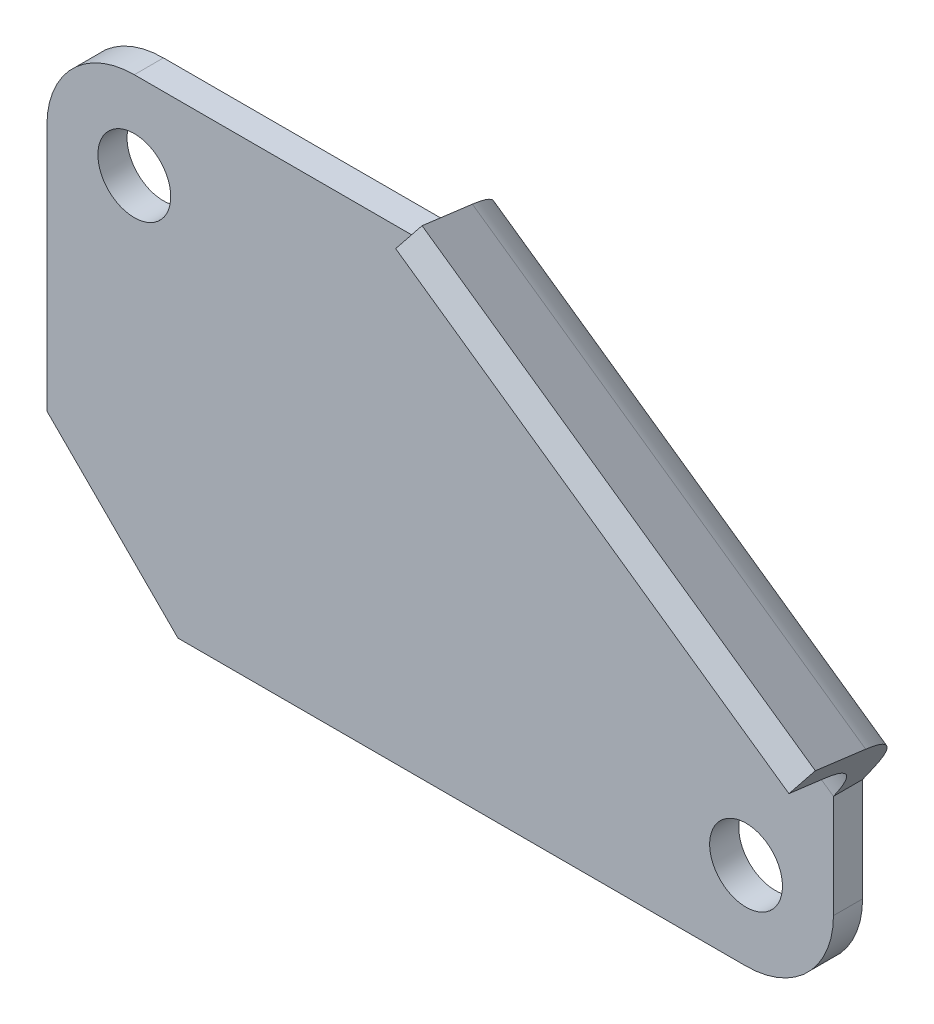
ISO-10303-21;
HEADER;
FILE_DESCRIPTION(('STEP AP214'),'2;1');
FILE_NAME('part.step','',(''),(''),'','','');
FILE_SCHEMA(('AUTOMOTIVE_DESIGN { 1 0 10303 214 1 1 1 1 }'));
ENDSEC;
DATA;
#1=APPLICATION_CONTEXT('core data for automotive mechanical design processes');
#2=APPLICATION_PROTOCOL_DEFINITION('international standard','automotive_design',2000,#1);
#3=PRODUCT_CONTEXT('',#1,'mechanical');
#4=PRODUCT('Part','Part','',(#3));
#5=PRODUCT_RELATED_PRODUCT_CATEGORY('part','',(#4));
#6=PRODUCT_DEFINITION_FORMATION('','',#4);
#7=PRODUCT_DEFINITION_CONTEXT('part definition',#1,'design');
#8=PRODUCT_DEFINITION('design','',#6,#7);
#9=PRODUCT_DEFINITION_SHAPE('','',#8);
#10=(LENGTH_UNIT() NAMED_UNIT(*) SI_UNIT(.MILLI.,.METRE.));
#11=(NAMED_UNIT(*) PLANE_ANGLE_UNIT() SI_UNIT($,.RADIAN.));
#12=(NAMED_UNIT(*) SI_UNIT($,.STERADIAN.) SOLID_ANGLE_UNIT());
#13=UNCERTAINTY_MEASURE_WITH_UNIT(LENGTH_MEASURE(1.E-05),#10,'distance_accuracy_value','');
#14=(GEOMETRIC_REPRESENTATION_CONTEXT(3) GLOBAL_UNCERTAINTY_ASSIGNED_CONTEXT((#13)) GLOBAL_UNIT_ASSIGNED_CONTEXT((#10,
#11,#12)) REPRESENTATION_CONTEXT('',''));
#15=CARTESIAN_POINT('',(0.,0.,0.));
#16=DIRECTION('',(0.,0.,1.));
#17=DIRECTION('',(1.,0.,0.));
#18=AXIS2_PLACEMENT_3D('',#15,#16,#17);
#19=CARTESIAN_POINT('',(12.,34.,4.));
#20=DIRECTION('',(0.,0.,-1.));
#21=DIRECTION('',(-1.,0.,0.));
#22=AXIS2_PLACEMENT_3D('',#19,#20,#21);
#23=PLANE('',#22);
#24=DIRECTION('',(0.707106781186547,-0.707106781186548,0.));
#25=VECTOR('',#24,1.);
#26=CARTESIAN_POINT('',(18.,-18.,4.));
#27=LINE('',#26,#25);
#28=CARTESIAN_POINT('',(0.,0.,4.));
#29=VERTEX_POINT('',#28);
#30=CARTESIAN_POINT('',(18.,-18.,4.));
#31=VERTEX_POINT('',#30);
#32=EDGE_CURVE('E213',#29,#31,#27,.T.);
#33=ORIENTED_EDGE('',*,*,#32,.T.);
#34=DIRECTION('',(1.,0.,0.));
#35=VECTOR('',#34,1.);
#36=CARTESIAN_POINT('',(95.9999999999999,-18.,4.));
#37=LINE('',#36,#35);
#38=CARTESIAN_POINT('',(95.9999999999999,-18.,4.));
#39=VERTEX_POINT('',#38);
#40=EDGE_CURVE('E297',#31,#39,#37,.T.);
#41=ORIENTED_EDGE('',*,*,#40,.T.);
#42=CARTESIAN_POINT('',(96.,-6.,4.));
#43=DIRECTION('',(0.,0.,1.));
#44=DIRECTION('',(-1.,0.,0.));
#45=AXIS2_PLACEMENT_3D('',#42,#43,#44);
#46=CIRCLE('',#45,12.);
#47=CARTESIAN_POINT('',(108.,-5.9999999999999,4.));
#48=VERTEX_POINT('',#47);
#49=EDGE_CURVE('E300',#39,#48,#46,.T.);
#50=ORIENTED_EDGE('',*,*,#49,.T.);
#51=DIRECTION('',(0.,1.,0.));
#52=VECTOR('',#51,1.);
#53=CARTESIAN_POINT('',(108.,8.18879293667554,4.));
#54=LINE('',#53,#52);
#55=CARTESIAN_POINT('',(108.,8.18879293667555,4.));
#56=VERTEX_POINT('',#55);
#57=EDGE_CURVE('E171',#48,#56,#54,.T.);
#58=ORIENTED_EDGE('',*,*,#57,.T.);
#59=DIRECTION('',(-0.819152044288991,0.573576436351047,0.));
#60=VECTOR('',#59,1.);
#61=CARTESIAN_POINT('',(54.,46.,4.));
#62=LINE('',#61,#60);
#63=CARTESIAN_POINT('',(53.9999999999996,45.9999999999994,4.));
#64=VERTEX_POINT('',#63);
#65=EDGE_CURVE('E158',#56,#64,#62,.T.);
#66=ORIENTED_EDGE('',*,*,#65,.T.);
#67=DIRECTION('',(-1.,0.,0.));
#68=VECTOR('',#67,1.);
#69=CARTESIAN_POINT('',(12.0000000000001,46.,4.));
#70=LINE('',#69,#68);
#71=CARTESIAN_POINT('',(12.0000000000001,46.,4.));
#72=VERTEX_POINT('',#71);
#73=EDGE_CURVE('E168',#64,#72,#70,.T.);
#74=ORIENTED_EDGE('',*,*,#73,.T.);
#75=CARTESIAN_POINT('',(12.,34.,4.));
#76=DIRECTION('',(0.,0.,1.));
#77=DIRECTION('',(-1.,0.,0.));
#78=AXIS2_PLACEMENT_3D('',#75,#76,#77);
#79=CIRCLE('',#78,12.);
#80=CARTESIAN_POINT('',(0.,33.9999999999999,4.));
#81=VERTEX_POINT('',#80);
#82=EDGE_CURVE('E179',#72,#81,#79,.T.);
#83=ORIENTED_EDGE('',*,*,#82,.T.);
#84=DIRECTION('',(0.,-1.,0.));
#85=VECTOR('',#84,1.);
#86=CARTESIAN_POINT('',(0.,0.,4.));
#87=LINE('',#86,#85);
#88=EDGE_CURVE('E182',#81,#29,#87,.T.);
#89=ORIENTED_EDGE('',*,*,#88,.T.);
#90=EDGE_LOOP('',(#33,#41,#50,#58,#66,#74,#83,#89));
#91=FACE_BOUND('',#90,.T.);
#92=CARTESIAN_POINT('',(12.,34.,4.));
#93=DIRECTION('',(0.,0.,1.));
#94=DIRECTION('',(1.,0.,0.));
#95=AXIS2_PLACEMENT_3D('',#92,#93,#94);
#96=CIRCLE('',#95,5.);
#97=CARTESIAN_POINT('',(17.,34.,4.));
#98=VERTEX_POINT('',#97);
#99=EDGE_CURVE('E194',#98,#98,#96,.T.);
#100=ORIENTED_EDGE('',*,*,#99,.F.);
#101=EDGE_LOOP('',(#100));
#102=FACE_BOUND('',#101,.T.);
#103=CARTESIAN_POINT('',(96.,-6.,4.));
#104=DIRECTION('',(0.,0.,1.));
#105=DIRECTION('',(1.,0.,0.));
#106=AXIS2_PLACEMENT_3D('',#103,#104,#105);
#107=CIRCLE('',#106,5.);
#108=CARTESIAN_POINT('',(101.,-6.,4.));
#109=VERTEX_POINT('',#108);
#110=EDGE_CURVE('E281',#109,#109,#107,.T.);
#111=ORIENTED_EDGE('',*,*,#110,.F.);
#112=EDGE_LOOP('',(#111));
#113=FACE_BOUND('',#112,.T.);
#114=ADVANCED_FACE('F45',(#91,#102,#113),#23,.F.);
#115=CARTESIAN_POINT('',(12.,34.,0.));
#116=DIRECTION('',(0.,0.,-1.));
#117=DIRECTION('',(-1.,0.,0.));
#118=AXIS2_PLACEMENT_3D('',#115,#116,#117);
#119=PLANE('',#118);
#120=CARTESIAN_POINT('',(12.,34.,0.));
#121=DIRECTION('',(0.,0.,1.));
#122=DIRECTION('',(1.,0.,0.));
#123=AXIS2_PLACEMENT_3D('',#120,#121,#122);
#124=CIRCLE('',#123,5.);
#125=CARTESIAN_POINT('',(17.,34.,0.));
#126=VERTEX_POINT('',#125);
#127=EDGE_CURVE('E285',#126,#126,#124,.T.);
#128=ORIENTED_EDGE('',*,*,#127,.T.);
#129=EDGE_LOOP('',(#128));
#130=FACE_BOUND('',#129,.T.);
#131=DIRECTION('',(0.573576436351039,0.819152044288996,0.));
#132=VECTOR('',#131,1.);
#133=CARTESIAN_POINT('',(53.9999999999996,45.9999999999994,0.));
#134=LINE('',#133,#132);
#135=CARTESIAN_POINT('',(54.,46.,0.));
#136=VERTEX_POINT('',#135);
#137=CARTESIAN_POINT('',(55.5475287655152,48.2101001218467,0.));
#138=VERTEX_POINT('',#137);
#139=EDGE_CURVE('E146',#136,#138,#134,.T.);
#140=ORIENTED_EDGE('',*,*,#139,.T.);
#141=DIRECTION('',(0.819152044288997,-0.573576436351039,0.));
#142=VECTOR('',#141,1.);
#143=CARTESIAN_POINT('',(33.0032614803912,63.9957660183047,0.));
#144=LINE('',#143,#142);
#145=CARTESIAN_POINT('',(109.547528765516,10.3988930585228,0.));
#146=VERTEX_POINT('',#145);
#147=EDGE_CURVE('E238',#138,#146,#144,.T.);
#148=ORIENTED_EDGE('',*,*,#147,.T.);
#149=DIRECTION('',(0.573576436351039,0.819152044288996,0.));
#150=VECTOR('',#149,1.);
#151=CARTESIAN_POINT('',(108.,8.18879293667555,0.));
#152=LINE('',#151,#150);
#153=CARTESIAN_POINT('',(108.,8.18879293667555,0.));
#154=VERTEX_POINT('',#153);
#155=EDGE_CURVE('E249',#154,#146,#152,.T.);
#156=ORIENTED_EDGE('',*,*,#155,.F.);
#157=DIRECTION('',(0.,1.,0.));
#158=VECTOR('',#157,1.);
#159=CARTESIAN_POINT('',(108.,8.18879293667554,0.));
#160=LINE('',#159,#158);
#161=CARTESIAN_POINT('',(108.,-5.9999999999999,0.));
#162=VERTEX_POINT('',#161);
#163=EDGE_CURVE('E200',#162,#154,#160,.T.);
#164=ORIENTED_EDGE('',*,*,#163,.F.);
#165=CARTESIAN_POINT('',(96.,-6.,0.));
#166=DIRECTION('',(0.,0.,1.));
#167=DIRECTION('',(-1.,0.,0.));
#168=AXIS2_PLACEMENT_3D('',#165,#166,#167);
#169=CIRCLE('',#168,12.);
#170=CARTESIAN_POINT('',(95.9999999999999,-18.,0.));
#171=VERTEX_POINT('',#170);
#172=EDGE_CURVE('E197',#171,#162,#169,.T.);
#173=ORIENTED_EDGE('',*,*,#172,.F.);
#174=DIRECTION('',(1.,0.,0.));
#175=VECTOR('',#174,1.);
#176=CARTESIAN_POINT('',(95.9999999999999,-18.,0.));
#177=LINE('',#176,#175);
#178=CARTESIAN_POINT('',(18.,-18.,0.));
#179=VERTEX_POINT('',#178);
#180=EDGE_CURVE('E193',#179,#171,#177,.T.);
#181=ORIENTED_EDGE('',*,*,#180,.F.);
#182=DIRECTION('',(0.707106781186547,-0.707106781186548,0.));
#183=VECTOR('',#182,1.);
#184=CARTESIAN_POINT('',(18.,-18.,0.));
#185=LINE('',#184,#183);
#186=CARTESIAN_POINT('',(0.,0.,0.));
#187=VERTEX_POINT('',#186);
#188=EDGE_CURVE('E189',#187,#179,#185,.T.);
#189=ORIENTED_EDGE('',*,*,#188,.F.);
#190=DIRECTION('',(0.,-1.,0.));
#191=VECTOR('',#190,1.);
#192=CARTESIAN_POINT('',(0.,0.,0.));
#193=LINE('',#192,#191);
#194=CARTESIAN_POINT('',(0.,33.9999999999999,0.));
#195=VERTEX_POINT('',#194);
#196=EDGE_CURVE('E210',#195,#187,#193,.T.);
#197=ORIENTED_EDGE('',*,*,#196,.F.);
#198=CARTESIAN_POINT('',(12.,34.,0.));
#199=DIRECTION('',(0.,0.,1.));
#200=DIRECTION('',(-1.,0.,0.));
#201=AXIS2_PLACEMENT_3D('',#198,#199,#200);
#202=CIRCLE('',#201,12.);
#203=CARTESIAN_POINT('',(12.0000000000001,46.,0.));
#204=VERTEX_POINT('',#203);
#205=EDGE_CURVE('E207',#204,#195,#202,.T.);
#206=ORIENTED_EDGE('',*,*,#205,.F.);
#207=DIRECTION('',(-1.,0.,0.));
#208=VECTOR('',#207,1.);
#209=CARTESIAN_POINT('',(12.0000000000001,46.,0.));
#210=LINE('',#209,#208);
#211=EDGE_CURVE('E204',#136,#204,#210,.T.);
#212=ORIENTED_EDGE('',*,*,#211,.F.);
#213=EDGE_LOOP('',(#140,#148,#156,#164,#173,#181,#189,#197,#206,#212));
#214=FACE_BOUND('',#213,.T.);
#215=CARTESIAN_POINT('',(96.,-6.,0.));
#216=DIRECTION('',(0.,0.,1.));
#217=DIRECTION('',(1.,0.,0.));
#218=AXIS2_PLACEMENT_3D('',#215,#216,#217);
#219=CIRCLE('',#218,5.);
#220=CARTESIAN_POINT('',(101.,-6.,0.));
#221=VERTEX_POINT('',#220);
#222=EDGE_CURVE('E272',#221,#221,#219,.T.);
#223=ORIENTED_EDGE('',*,*,#222,.T.);
#224=EDGE_LOOP('',(#223));
#225=FACE_BOUND('',#224,.T.);
#226=ADVANCED_FACE('F246',(#130,#214,#225),#119,.T.);
#227=CARTESIAN_POINT('',(18.,-18.,4.));
#228=DIRECTION('',(0.707106781186548,0.707106781186547,0.));
#229=DIRECTION('',(-0.707106781186547,0.707106781186548,0.));
#230=AXIS2_PLACEMENT_3D('',#227,#228,#229);
#231=PLANE('',#230);
#232=ORIENTED_EDGE('',*,*,#188,.T.);
#233=DIRECTION('',(0.,0.,-1.));
#234=VECTOR('',#233,1.);
#235=CARTESIAN_POINT('',(18.,-18.,4.));
#236=LINE('',#235,#234);
#237=EDGE_CURVE('E234',#31,#179,#236,.T.);
#238=ORIENTED_EDGE('',*,*,#237,.F.);
#239=ORIENTED_EDGE('',*,*,#32,.F.);
#240=DIRECTION('',(0.,0.,-1.));
#241=VECTOR('',#240,1.);
#242=CARTESIAN_POINT('',(0.,0.,4.));
#243=LINE('',#242,#241);
#244=EDGE_CURVE('E188',#29,#187,#243,.T.);
#245=ORIENTED_EDGE('',*,*,#244,.T.);
#246=EDGE_LOOP('',(#232,#238,#239,#245));
#247=FACE_BOUND('',#246,.T.);
#248=ADVANCED_FACE('F334',(#247),#231,.F.);
#249=CARTESIAN_POINT('',(95.9999999999999,-18.,4.));
#250=DIRECTION('',(0.,1.,0.));
#251=DIRECTION('',(-1.,0.,0.));
#252=AXIS2_PLACEMENT_3D('',#249,#250,#251);
#253=PLANE('',#252);
#254=ORIENTED_EDGE('',*,*,#180,.T.);
#255=DIRECTION('',(0.,0.,-1.));
#256=VECTOR('',#255,1.);
#257=CARTESIAN_POINT('',(95.9999999999999,-18.,4.));
#258=LINE('',#257,#256);
#259=EDGE_CURVE('E230',#39,#171,#258,.T.);
#260=ORIENTED_EDGE('',*,*,#259,.F.);
#261=ORIENTED_EDGE('',*,*,#40,.F.);
#262=ORIENTED_EDGE('',*,*,#237,.T.);
#263=EDGE_LOOP('',(#254,#260,#261,#262));
#264=FACE_BOUND('',#263,.T.);
#265=ADVANCED_FACE('F357',(#264),#253,.F.);
#266=CARTESIAN_POINT('',(96.,-6.,4.));
#267=DIRECTION('',(0.,0.,-1.));
#268=DIRECTION('',(-1.,0.,0.));
#269=AXIS2_PLACEMENT_3D('',#266,#267,#268);
#270=CYLINDRICAL_SURFACE('',#269,12.);
#271=ORIENTED_EDGE('',*,*,#172,.T.);
#272=DIRECTION('',(0.,0.,-1.));
#273=VECTOR('',#272,1.);
#274=CARTESIAN_POINT('',(108.,-5.9999999999999,4.));
#275=LINE('',#274,#273);
#276=EDGE_CURVE('E226',#48,#162,#275,.T.);
#277=ORIENTED_EDGE('',*,*,#276,.F.);
#278=ORIENTED_EDGE('',*,*,#49,.F.);
#279=ORIENTED_EDGE('',*,*,#259,.T.);
#280=EDGE_LOOP('',(#271,#277,#278,#279));
#281=FACE_BOUND('',#280,.T.);
#282=ADVANCED_FACE('F353',(#281),#270,.T.);
#283=CARTESIAN_POINT('',(108.,8.18879293667554,4.));
#284=DIRECTION('',(-1.,0.,0.));
#285=DIRECTION('',(0.,-1.,0.));
#286=AXIS2_PLACEMENT_3D('',#283,#284,#285);
#287=PLANE('',#286);
#288=ORIENTED_EDGE('',*,*,#163,.T.);
#289=DIRECTION('',(0.,0.,-1.));
#290=VECTOR('',#289,1.);
#291=CARTESIAN_POINT('',(108.,8.18879293667554,4.));
#292=LINE('',#291,#290);
#293=EDGE_CURVE('E151',#56,#154,#292,.T.);
#294=ORIENTED_EDGE('',*,*,#293,.F.);
#295=ORIENTED_EDGE('',*,*,#57,.F.);
#296=ORIENTED_EDGE('',*,*,#276,.T.);
#297=EDGE_LOOP('',(#288,#294,#295,#296));
#298=FACE_BOUND('',#297,.T.);
#299=ADVANCED_FACE('F351',(#298),#287,.F.);
#300=CARTESIAN_POINT('',(12.0000000000001,46.,4.));
#301=DIRECTION('',(0.,-1.,0.));
#302=DIRECTION('',(1.,0.,0.));
#303=AXIS2_PLACEMENT_3D('',#300,#301,#302);
#304=PLANE('',#303);
#305=ORIENTED_EDGE('',*,*,#211,.T.);
#306=DIRECTION('',(0.,0.,-1.));
#307=VECTOR('',#306,1.);
#308=CARTESIAN_POINT('',(12.0000000000001,46.,4.));
#309=LINE('',#308,#307);
#310=EDGE_CURVE('E152',#72,#204,#309,.T.);
#311=ORIENTED_EDGE('',*,*,#310,.F.);
#312=ORIENTED_EDGE('',*,*,#73,.F.);
#313=DIRECTION('',(0.,0.,-1.));
#314=VECTOR('',#313,1.);
#315=CARTESIAN_POINT('',(54.,46.,4.));
#316=LINE('',#315,#314);
#317=EDGE_CURVE('E139',#64,#136,#316,.T.);
#318=ORIENTED_EDGE('',*,*,#317,.T.);
#319=EDGE_LOOP('',(#305,#311,#312,#318));
#320=FACE_BOUND('',#319,.T.);
#321=ADVANCED_FACE('F175',(#320),#304,.F.);
#322=CARTESIAN_POINT('',(12.,34.,4.));
#323=DIRECTION('',(0.,0.,-1.));
#324=DIRECTION('',(-1.,0.,0.));
#325=AXIS2_PLACEMENT_3D('',#322,#323,#324);
#326=CYLINDRICAL_SURFACE('',#325,12.);
#327=ORIENTED_EDGE('',*,*,#205,.T.);
#328=DIRECTION('',(0.,0.,-1.));
#329=VECTOR('',#328,1.);
#330=CARTESIAN_POINT('',(0.,33.9999999999999,4.));
#331=LINE('',#330,#329);
#332=EDGE_CURVE('E217',#81,#195,#331,.T.);
#333=ORIENTED_EDGE('',*,*,#332,.F.);
#334=ORIENTED_EDGE('',*,*,#82,.F.);
#335=ORIENTED_EDGE('',*,*,#310,.T.);
#336=EDGE_LOOP('',(#327,#333,#334,#335));
#337=FACE_BOUND('',#336,.T.);
#338=ADVANCED_FACE('F344',(#337),#326,.T.);
#339=CARTESIAN_POINT('',(0.,0.,4.));
#340=DIRECTION('',(1.,0.,0.));
#341=DIRECTION('',(0.,0.,-1.));
#342=AXIS2_PLACEMENT_3D('',#339,#340,#341);
#343=PLANE('',#342);
#344=ORIENTED_EDGE('',*,*,#196,.T.);
#345=ORIENTED_EDGE('',*,*,#244,.F.);
#346=ORIENTED_EDGE('',*,*,#88,.F.);
#347=ORIENTED_EDGE('',*,*,#332,.T.);
#348=EDGE_LOOP('',(#344,#345,#346,#347));
#349=FACE_BOUND('',#348,.T.);
#350=ADVANCED_FACE('F341',(#349),#343,.F.);
#351=CARTESIAN_POINT('',(12.,34.,4.));
#352=DIRECTION('',(0.,0.,-1.));
#353=DIRECTION('',(-1.,0.,0.));
#354=AXIS2_PLACEMENT_3D('',#351,#352,#353);
#355=CYLINDRICAL_SURFACE('',#354,5.);
#356=ORIENTED_EDGE('',*,*,#99,.T.);
#357=EDGE_LOOP('',(#356));
#358=FACE_BOUND('',#357,.T.);
#359=ORIENTED_EDGE('',*,*,#127,.F.);
#360=EDGE_LOOP('',(#359));
#361=FACE_BOUND('',#360,.T.);
#362=ADVANCED_FACE('F338',(#358,#361),#355,.F.);
#363=CARTESIAN_POINT('',(96.,-6.,4.));
#364=DIRECTION('',(0.,0.,-1.));
#365=DIRECTION('',(-1.,0.,0.));
#366=AXIS2_PLACEMENT_3D('',#363,#364,#365);
#367=CYLINDRICAL_SURFACE('',#366,5.);
#368=ORIENTED_EDGE('',*,*,#110,.T.);
#369=EDGE_LOOP('',(#368));
#370=FACE_BOUND('',#369,.T.);
#371=ORIENTED_EDGE('',*,*,#222,.F.);
#372=EDGE_LOOP('',(#371));
#373=FACE_BOUND('',#372,.T.);
#374=ADVANCED_FACE('F406',(#370,#373),#367,.F.);
#375=CARTESIAN_POINT('',(53.9999999999996,45.9999999999995,16.));
#376=DIRECTION('',(0.819152044288997,-0.573576436351039,0.));
#377=DIRECTION('',(0.573576436351039,0.819152044288997,0.));
#378=AXIS2_PLACEMENT_3D('',#375,#376,#377);
#379=CYLINDRICAL_SURFACE('',#378,12.);
#380=CARTESIAN_POINT('',(108.,8.18879293667559,16.));
#381=DIRECTION('',(-0.819152044288997,0.573576436351039,0.));
#382=DIRECTION('',(-0.573576436351039,-0.819152044288997,0.));
#383=AXIS2_PLACEMENT_3D('',#380,#381,#382);
#384=CIRCLE('',#383,12.);
#385=CARTESIAN_POINT('',(114.381729733736,17.3028475354772,11.504720879009));
#386=VERTEX_POINT('',#385);
#387=EDGE_CURVE('E255',#386,#56,#384,.T.);
#388=ORIENTED_EDGE('',*,*,#387,.F.);
#389=DIRECTION('',(0.819152044288997,-0.573576436351039,0.));
#390=VECTOR('',#389,1.);
#391=CARTESIAN_POINT('',(60.3817297337353,55.114054598801,11.504720879009));
#392=LINE('',#391,#390);
#393=CARTESIAN_POINT('',(60.3817297337353,55.114054598801,11.504720879009));
#394=VERTEX_POINT('',#393);
#395=EDGE_CURVE('E160',#394,#386,#392,.T.);
#396=ORIENTED_EDGE('',*,*,#395,.F.);
#397=CARTESIAN_POINT('',(53.9999999999996,45.9999999999995,16.));
#398=DIRECTION('',(-0.819152044288997,0.573576436351039,0.));
#399=DIRECTION('',(-0.573576436351039,-0.819152044288997,0.));
#400=AXIS2_PLACEMENT_3D('',#397,#398,#399);
#401=CIRCLE('',#400,12.);
#402=EDGE_CURVE('E143',#394,#64,#401,.T.);
#403=ORIENTED_EDGE('',*,*,#402,.T.);
#404=ORIENTED_EDGE('',*,*,#65,.F.);
#405=EDGE_LOOP('',(#388,#396,#403,#404));
#406=FACE_BOUND('',#405,.T.);
#407=ADVANCED_FACE('F157',(#406),#379,.F.);
#408=CARTESIAN_POINT('',(61.8869452158429,57.2637250892905,18.));
#409=DIRECTION('',(-0.531810811144637,-0.759504549900135,0.374606593415915));
#410=DIRECTION('',(0.819152044288997,-0.573576436351039,0.));
#411=AXIS2_PLACEMENT_3D('',#408,#409,#410);
#412=PLANE('',#411);
#413=DIRECTION('',(-0.214865514885103,-0.306859756800784,-0.927183854566786));
#414=VECTOR('',#413,1.);
#415=CARTESIAN_POINT('',(115.886945215843,19.4525180259666,18.));
#416=LINE('',#415,#414);
#417=CARTESIAN_POINT('',(115.886945215843,19.4525180259666,18.));
#418=VERTEX_POINT('',#417);
#419=EDGE_CURVE('E162',#418,#386,#416,.T.);
#420=ORIENTED_EDGE('',*,*,#419,.F.);
#421=DIRECTION('',(0.819152044288997,-0.573576436351039,0.));
#422=VECTOR('',#421,1.);
#423=CARTESIAN_POINT('',(61.8869452158429,57.2637250892905,18.));
#424=LINE('',#423,#422);
#425=CARTESIAN_POINT('',(61.8869452158429,57.2637250892905,18.));
#426=VERTEX_POINT('',#425);
#427=EDGE_CURVE('E273',#426,#418,#424,.T.);
#428=ORIENTED_EDGE('',*,*,#427,.F.);
#429=DIRECTION('',(-0.214865514885103,-0.306859756800784,-0.927183854566786));
#430=VECTOR('',#429,1.);
#431=CARTESIAN_POINT('',(61.8869452158429,57.2637250892905,18.));
#432=LINE('',#431,#430);
#433=EDGE_CURVE('E280',#426,#394,#432,.T.);
#434=ORIENTED_EDGE('',*,*,#433,.T.);
#435=ORIENTED_EDGE('',*,*,#395,.T.);
#436=EDGE_LOOP('',(#420,#428,#434,#435));
#437=FACE_BOUND('',#436,.T.);
#438=ADVANCED_FACE('F321',(#437),#412,.T.);
#439=CARTESIAN_POINT('',(64.0141884604215,60.301743288891,16.5015736263363));
#440=DIRECTION('',(0.214865514885104,0.306859756800785,0.927183854566786));
#441=DIRECTION('',(0.,-0.949357382022726,0.31419828325272));
#442=AXIS2_PLACEMENT_3D('',#439,#440,#441);
#443=PLANE('',#442);
#444=DIRECTION('',(-0.531810811144636,-0.759504549900135,0.374606593415917));
#445=VECTOR('',#444,1.);
#446=CARTESIAN_POINT('',(118.014188460422,22.4905362255672,16.5015736263363));
#447=LINE('',#446,#445);
#448=CARTESIAN_POINT('',(118.014188460422,22.4905362255672,16.5015736263363));
#449=VERTEX_POINT('',#448);
#450=EDGE_CURVE('E259',#449,#418,#447,.T.);
#451=ORIENTED_EDGE('',*,*,#450,.F.);
#452=DIRECTION('',(0.819152044288997,-0.573576436351039,0.));
#453=VECTOR('',#452,1.);
#454=CARTESIAN_POINT('',(64.0141884604215,60.301743288891,16.5015736263363));
#455=LINE('',#454,#453);
#456=CARTESIAN_POINT('',(64.0141884604215,60.301743288891,16.5015736263363));
#457=VERTEX_POINT('',#456);
#458=EDGE_CURVE('E276',#457,#449,#455,.T.);
#459=ORIENTED_EDGE('',*,*,#458,.F.);
#460=DIRECTION('',(-0.531810811144636,-0.759504549900135,0.374606593415917));
#461=VECTOR('',#460,1.);
#462=CARTESIAN_POINT('',(64.0141884604215,60.301743288891,16.5015736263363));
#463=LINE('',#462,#461);
#464=EDGE_CURVE('E305',#457,#426,#463,.T.);
#465=ORIENTED_EDGE('',*,*,#464,.T.);
#466=ORIENTED_EDGE('',*,*,#427,.T.);
#467=EDGE_LOOP('',(#451,#459,#465,#466));
#468=FACE_BOUND('',#467,.T.);
#469=ADVANCED_FACE('F318',(#468),#443,.T.);
#470=CARTESIAN_POINT('',(60.190115062062,54.8404004873884,0.));
#471=DIRECTION('',(0.531810811144637,0.759504549900135,-0.374606593415916));
#472=DIRECTION('',(-0.819152044288997,0.573576436351039,0.));
#473=AXIS2_PLACEMENT_3D('',#470,#471,#472);
#474=PLANE('',#473);
#475=DIRECTION('',(0.214865514885103,0.306859756800784,0.927183854566786));
#476=VECTOR('',#475,1.);
#477=CARTESIAN_POINT('',(114.190115062062,17.0291934240645,0.));
#478=LINE('',#477,#476);
#479=CARTESIAN_POINT('',(115.929258499251,19.5129476573244,7.50472087900901));
#480=VERTEX_POINT('',#479);
#481=EDGE_CURVE('E254',#480,#449,#478,.T.);
#482=ORIENTED_EDGE('',*,*,#481,.F.);
#483=DIRECTION('',(0.819152044288997,-0.573576436351039,0.));
#484=VECTOR('',#483,1.);
#485=CARTESIAN_POINT('',(61.9292584992508,57.3241547206483,7.50472087900901));
#486=LINE('',#485,#484);
#487=CARTESIAN_POINT('',(61.9292584992508,57.3241547206483,7.50472087900901));
#488=VERTEX_POINT('',#487);
#489=EDGE_CURVE('E54',#480,#488,#486,.F.);
#490=ORIENTED_EDGE('',*,*,#489,.T.);
#491=DIRECTION('',(0.214865514885103,0.306859756800784,0.927183854566786));
#492=VECTOR('',#491,1.);
#493=CARTESIAN_POINT('',(60.190115062062,54.8404004873884,0.));
#494=LINE('',#493,#492);
#495=EDGE_CURVE('E308',#488,#457,#494,.T.);
#496=ORIENTED_EDGE('',*,*,#495,.T.);
#497=ORIENTED_EDGE('',*,*,#458,.T.);
#498=EDGE_LOOP('',(#482,#490,#496,#497));
#499=FACE_BOUND('',#498,.T.);
#500=ADVANCED_FACE('F314',(#499),#474,.T.);
#501=CARTESIAN_POINT('',(53.9999999999996,45.9999999999995,16.));
#502=DIRECTION('',(-0.819152044288997,0.573576436351039,0.));
#503=DIRECTION('',(-0.573576436351039,-0.819152044288997,0.));
#504=AXIS2_PLACEMENT_3D('',#501,#502,#503);
#505=PLANE('',#504);
#506=ORIENTED_EDGE('',*,*,#495,.F.);
#507=CARTESIAN_POINT('',(55.5475287655152,48.2101001218467,12.));
#508=DIRECTION('',(-0.819152044288997,0.573576436351039,0.));
#509=DIRECTION('',(-0.573576436351039,-0.819152044288997,0.));
#510=AXIS2_PLACEMENT_3D('',#507,#508,#509);
#511=CIRCLE('',#510,12.);
#512=EDGE_CURVE('E11',#488,#138,#511,.T.);
#513=ORIENTED_EDGE('',*,*,#512,.T.);
#514=ORIENTED_EDGE('',*,*,#139,.F.);
#515=ORIENTED_EDGE('',*,*,#317,.F.);
#516=ORIENTED_EDGE('',*,*,#402,.F.);
#517=ORIENTED_EDGE('',*,*,#433,.F.);
#518=ORIENTED_EDGE('',*,*,#464,.F.);
#519=EDGE_LOOP('',(#506,#513,#514,#515,#516,#517,#518));
#520=FACE_BOUND('',#519,.T.);
#521=ADVANCED_FACE('F141',(#520),#505,.T.);
#522=CARTESIAN_POINT('',(108.,8.18879293667559,16.));
#523=DIRECTION('',(-0.819152044288997,0.573576436351039,0.));
#524=DIRECTION('',(-0.573576436351039,-0.819152044288997,0.));
#525=AXIS2_PLACEMENT_3D('',#522,#523,#524);
#526=PLANE('',#525);
#527=ORIENTED_EDGE('',*,*,#155,.T.);
#528=CARTESIAN_POINT('',(109.547528765516,10.3988930585228,12.));
#529=DIRECTION('',(-0.819152044288997,0.573576436351039,0.));
#530=DIRECTION('',(-0.573576436351039,-0.819152044288997,0.));
#531=AXIS2_PLACEMENT_3D('',#528,#529,#530);
#532=CIRCLE('',#531,12.);
#533=EDGE_CURVE('E68',#146,#480,#532,.F.);
#534=ORIENTED_EDGE('',*,*,#533,.T.);
#535=ORIENTED_EDGE('',*,*,#481,.T.);
#536=ORIENTED_EDGE('',*,*,#450,.T.);
#537=ORIENTED_EDGE('',*,*,#419,.T.);
#538=ORIENTED_EDGE('',*,*,#387,.T.);
#539=ORIENTED_EDGE('',*,*,#293,.T.);
#540=EDGE_LOOP('',(#527,#534,#535,#536,#537,#538,#539));
#541=FACE_BOUND('',#540,.T.);
#542=ADVANCED_FACE('F252',(#541),#526,.F.);
#543=CARTESIAN_POINT('',(33.0032614803912,63.9957660183047,12.));
#544=DIRECTION('',(0.819152044288997,-0.573576436351039,0.));
#545=DIRECTION('',(0.573576436351039,0.819152044288997,0.));
#546=AXIS2_PLACEMENT_3D('',#543,#544,#545);
#547=CYLINDRICAL_SURFACE('',#546,12.);
#548=ORIENTED_EDGE('',*,*,#512,.F.);
#549=ORIENTED_EDGE('',*,*,#489,.F.);
#550=ORIENTED_EDGE('',*,*,#533,.F.);
#551=ORIENTED_EDGE('',*,*,#147,.F.);
#552=EDGE_LOOP('',(#548,#549,#550,#551));
#553=FACE_BOUND('',#552,.T.);
#554=ADVANCED_FACE('F47',(#553),#547,.T.);
#555=CLOSED_SHELL('',(#114,#226,#248,#265,#282,#299,#321,#338,#350,#362,#374,#407,#438,#469,
#500,#521,#542,#554));
#556=MANIFOLD_SOLID_BREP('B2',#555);
#557=ADVANCED_BREP_SHAPE_REPRESENTATION('',(#18,#556),#14);
#558=SHAPE_DEFINITION_REPRESENTATION(#9,#557);
ENDSEC;
END-ISO-10303-21;
